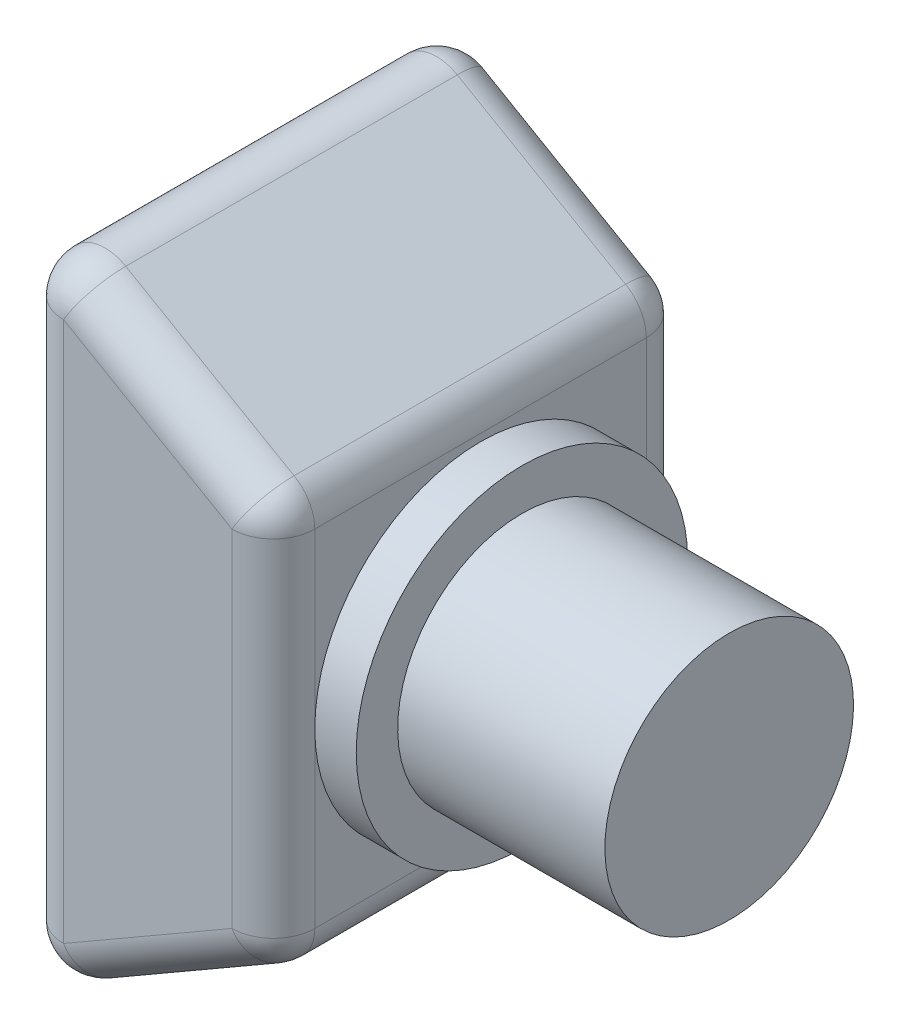
ISO-10303-21;
HEADER;
FILE_DESCRIPTION(('STEP AP214'),'2;1');
FILE_NAME('part.step','',(''),(''),'','','');
FILE_SCHEMA(('AUTOMOTIVE_DESIGN { 1 0 10303 214 1 1 1 1 }'));
ENDSEC;
DATA;
#1=APPLICATION_CONTEXT('core data for automotive mechanical design processes');
#2=APPLICATION_PROTOCOL_DEFINITION('international standard','automotive_design',2000,#1);
#3=PRODUCT_CONTEXT('',#1,'mechanical');
#4=PRODUCT('Part','Part','',(#3));
#5=PRODUCT_RELATED_PRODUCT_CATEGORY('part','',(#4));
#6=PRODUCT_DEFINITION_FORMATION('','',#4);
#7=PRODUCT_DEFINITION_CONTEXT('part definition',#1,'design');
#8=PRODUCT_DEFINITION('design','',#6,#7);
#9=PRODUCT_DEFINITION_SHAPE('','',#8);
#10=(LENGTH_UNIT() NAMED_UNIT(*) SI_UNIT(.MILLI.,.METRE.));
#11=(NAMED_UNIT(*) PLANE_ANGLE_UNIT() SI_UNIT($,.RADIAN.));
#12=(NAMED_UNIT(*) SI_UNIT($,.STERADIAN.) SOLID_ANGLE_UNIT());
#13=UNCERTAINTY_MEASURE_WITH_UNIT(LENGTH_MEASURE(1.E-05),#10,'distance_accuracy_value','');
#14=(GEOMETRIC_REPRESENTATION_CONTEXT(3) GLOBAL_UNCERTAINTY_ASSIGNED_CONTEXT((#13)) GLOBAL_UNIT_ASSIGNED_CONTEXT((#10,
#11,#12)) REPRESENTATION_CONTEXT('',''));
#15=CARTESIAN_POINT('',(0.,0.,0.));
#16=DIRECTION('',(0.,0.,1.));
#17=DIRECTION('',(1.,0.,0.));
#18=AXIS2_PLACEMENT_3D('',#15,#16,#17);
#19=CARTESIAN_POINT('',(6.06217782649105,4.75,10.));
#20=DIRECTION('',(-1.,0.,0.));
#21=DIRECTION('',(0.,0.,1.));
#22=AXIS2_PLACEMENT_3D('',#19,#20,#21);
#23=PLANE('',#22);
#24=CARTESIAN_POINT('',(6.06217782649105,0.,5.));
#25=DIRECTION('',(1.,0.,0.));
#26=DIRECTION('',(0.,1.,0.));
#27=AXIS2_PLACEMENT_3D('',#24,#25,#26);
#28=CIRCLE('',#27,4.);
#29=CARTESIAN_POINT('',(6.06217782649105,0.,9.));
#30=VERTEX_POINT('',#29);
#31=CARTESIAN_POINT('',(6.06217782649105,0.,0.999999999999999));
#32=VERTEX_POINT('',#31);
#33=EDGE_CURVE('E152',#30,#32,#28,.T.);
#34=ORIENTED_EDGE('',*,*,#33,.F.);
#35=DIRECTION('',(0.,1.,0.));
#36=VECTOR('',#35,1.);
#37=CARTESIAN_POINT('',(6.06217782649105,4.75,9.));
#38=LINE('',#37,#36);
#39=CARTESIAN_POINT('',(6.06217782649105,-4.17264973081038,9.));
#40=VERTEX_POINT('',#39);
#41=EDGE_CURVE('E139',#30,#40,#38,.F.);
#42=ORIENTED_EDGE('',*,*,#41,.T.);
#43=DIRECTION('',(0.,0.,-1.));
#44=VECTOR('',#43,1.);
#45=CARTESIAN_POINT('',(6.06217782649105,-4.17264973081038,10.));
#46=LINE('',#45,#44);
#47=CARTESIAN_POINT('',(6.06217782649105,-4.17264973081038,0.999999999999999));
#48=VERTEX_POINT('',#47);
#49=EDGE_CURVE('E177',#40,#48,#46,.T.);
#50=ORIENTED_EDGE('',*,*,#49,.T.);
#51=DIRECTION('',(0.,1.,0.));
#52=VECTOR('',#51,1.);
#53=CARTESIAN_POINT('',(6.06217782649105,4.17264973081038,0.999999999999999));
#54=LINE('',#53,#52);
#55=EDGE_CURVE('E149',#48,#32,#54,.T.);
#56=ORIENTED_EDGE('',*,*,#55,.T.);
#57=EDGE_LOOP('',(#34,#42,#50,#56));
#58=FACE_BOUND('',#57,.T.);
#59=ADVANCED_FACE('F34',(#58),#23,.F.);
#60=CARTESIAN_POINT('',(6.06217782649105,-4.75,10.));
#61=DIRECTION('',(-0.500000000000005,0.866025403784436,0.));
#62=DIRECTION('',(-0.866025403784436,-0.500000000000005,0.));
#63=AXIS2_PLACEMENT_3D('',#60,#61,#62);
#64=PLANE('',#63);
#65=DIRECTION('',(0.,0.,-1.));
#66=VECTOR('',#65,1.);
#67=CARTESIAN_POINT('',(5.56217782649106,-5.03867513459481,10.));
#68=LINE('',#67,#66);
#69=CARTESIAN_POINT('',(5.56217782649106,-5.03867513459481,0.999999999999999));
#70=VERTEX_POINT('',#69);
#71=CARTESIAN_POINT('',(5.56217782649106,-5.03867513459481,9.));
#72=VERTEX_POINT('',#71);
#73=EDGE_CURVE('E163',#70,#72,#68,.F.);
#74=ORIENTED_EDGE('',*,*,#73,.T.);
#75=DIRECTION('',(0.866025403784436,0.500000000000005,0.));
#76=VECTOR('',#75,1.);
#77=CARTESIAN_POINT('',(6.06217782649105,-4.75,9.));
#78=LINE('',#77,#76);
#79=CARTESIAN_POINT('',(1.5,-7.38397459621558,9.));
#80=VERTEX_POINT('',#79);
#81=EDGE_CURVE('E202',#72,#80,#78,.F.);
#82=ORIENTED_EDGE('',*,*,#81,.T.);
#83=DIRECTION('',(0.,0.,-1.));
#84=VECTOR('',#83,1.);
#85=CARTESIAN_POINT('',(1.5,-7.38397459621558,10.));
#86=LINE('',#85,#84);
#87=CARTESIAN_POINT('',(1.5,-7.38397459621558,0.999999999999999));
#88=VERTEX_POINT('',#87);
#89=EDGE_CURVE('E166',#80,#88,#86,.T.);
#90=ORIENTED_EDGE('',*,*,#89,.T.);
#91=DIRECTION('',(0.866025403784436,0.500000000000005,0.));
#92=VECTOR('',#91,1.);
#93=CARTESIAN_POINT('',(5.56217782649106,-5.03867513459481,0.999999999999999));
#94=LINE('',#93,#92);
#95=EDGE_CURVE('E200',#88,#70,#94,.T.);
#96=ORIENTED_EDGE('',*,*,#95,.T.);
#97=EDGE_LOOP('',(#74,#82,#90,#96));
#98=FACE_BOUND('',#97,.T.);
#99=ADVANCED_FACE('F333',(#98),#64,.F.);
#100=EDGE_CURVE('E51',#32,#30,#28,.T.);
#101=ORIENTED_EDGE('',*,*,#100,.F.);
#102=CARTESIAN_POINT('',(6.06217782649105,4.17264973081038,0.999999999999999));
#103=VERTEX_POINT('',#102);
#104=EDGE_CURVE('E233',#32,#103,#54,.T.);
#105=ORIENTED_EDGE('',*,*,#104,.T.);
#106=DIRECTION('',(0.,0.,-1.));
#107=VECTOR('',#106,1.);
#108=CARTESIAN_POINT('',(6.06217782649105,4.17264973081038,10.));
#109=LINE('',#108,#107);
#110=CARTESIAN_POINT('',(6.06217782649105,4.17264973081038,9.));
#111=VERTEX_POINT('',#110);
#112=EDGE_CURVE('E135',#103,#111,#109,.F.);
#113=ORIENTED_EDGE('',*,*,#112,.T.);
#114=EDGE_CURVE('E43',#111,#30,#38,.F.);
#115=ORIENTED_EDGE('',*,*,#114,.T.);
#116=EDGE_LOOP('',(#101,#105,#113,#115));
#117=FACE_BOUND('',#116,.T.);
#118=ADVANCED_FACE('F133',(#117),#23,.F.);
#119=CARTESIAN_POINT('',(0.,8.25000000000003,10.));
#120=DIRECTION('',(-0.500000000000004,-0.866025403784436,0.));
#121=DIRECTION('',(0.866025403784436,-0.500000000000004,0.));
#122=AXIS2_PLACEMENT_3D('',#119,#120,#121);
#123=PLANE('',#122);
#124=DIRECTION('',(0.,0.,-1.));
#125=VECTOR('',#124,1.);
#126=CARTESIAN_POINT('',(1.5,7.38397459621558,10.));
#127=LINE('',#126,#125);
#128=CARTESIAN_POINT('',(1.5,7.38397459621558,0.999999999999999));
#129=VERTEX_POINT('',#128);
#130=CARTESIAN_POINT('',(1.5,7.38397459621558,9.));
#131=VERTEX_POINT('',#130);
#132=EDGE_CURVE('E179',#129,#131,#127,.F.);
#133=ORIENTED_EDGE('',*,*,#132,.T.);
#134=DIRECTION('',(-0.866025403784436,0.500000000000004,0.));
#135=VECTOR('',#134,1.);
#136=CARTESIAN_POINT('',(0.,8.25000000000003,9.));
#137=LINE('',#136,#135);
#138=CARTESIAN_POINT('',(5.56217782649106,5.03867513459482,9.));
#139=VERTEX_POINT('',#138);
#140=EDGE_CURVE('E218',#131,#139,#137,.F.);
#141=ORIENTED_EDGE('',*,*,#140,.T.);
#142=DIRECTION('',(0.,0.,-1.));
#143=VECTOR('',#142,1.);
#144=CARTESIAN_POINT('',(5.56217782649106,5.03867513459482,10.));
#145=LINE('',#144,#143);
#146=CARTESIAN_POINT('',(5.56217782649106,5.03867513459482,0.999999999999999));
#147=VERTEX_POINT('',#146);
#148=EDGE_CURVE('E182',#139,#147,#145,.T.);
#149=ORIENTED_EDGE('',*,*,#148,.T.);
#150=DIRECTION('',(-0.866025403784436,0.500000000000004,0.));
#151=VECTOR('',#150,1.);
#152=CARTESIAN_POINT('',(1.5,7.38397459621558,0.999999999999999));
#153=LINE('',#152,#151);
#154=EDGE_CURVE('E216',#147,#129,#153,.T.);
#155=ORIENTED_EDGE('',*,*,#154,.T.);
#156=EDGE_LOOP('',(#133,#141,#149,#155));
#157=FACE_BOUND('',#156,.T.);
#158=ADVANCED_FACE('F316',(#157),#123,.F.);
#159=CARTESIAN_POINT('',(0.,-8.25000000000003,10.));
#160=DIRECTION('',(1.,0.,0.));
#161=DIRECTION('',(0.,1.,0.));
#162=AXIS2_PLACEMENT_3D('',#159,#160,#161);
#163=PLANE('',#162);
#164=DIRECTION('',(0.,0.,-1.));
#165=VECTOR('',#164,1.);
#166=CARTESIAN_POINT('',(0.,-6.51794919243114,10.));
#167=LINE('',#166,#165);
#168=CARTESIAN_POINT('',(0.,-6.51794919243114,0.999999999999999));
#169=VERTEX_POINT('',#168);
#170=CARTESIAN_POINT('',(0.,-6.51794919243114,9.));
#171=VERTEX_POINT('',#170);
#172=EDGE_CURVE('E173',#169,#171,#167,.F.);
#173=ORIENTED_EDGE('',*,*,#172,.T.);
#174=DIRECTION('',(0.,-1.,0.));
#175=VECTOR('',#174,1.);
#176=CARTESIAN_POINT('',(0.,-8.25000000000003,9.));
#177=LINE('',#176,#175);
#178=CARTESIAN_POINT('',(0.,6.51794919243114,9.));
#179=VERTEX_POINT('',#178);
#180=EDGE_CURVE('E210',#171,#179,#177,.F.);
#181=ORIENTED_EDGE('',*,*,#180,.T.);
#182=DIRECTION('',(0.,0.,-1.));
#183=VECTOR('',#182,1.);
#184=CARTESIAN_POINT('',(0.,6.51794919243114,10.));
#185=LINE('',#184,#183);
#186=CARTESIAN_POINT('',(0.,6.51794919243114,0.999999999999999));
#187=VERTEX_POINT('',#186);
#188=EDGE_CURVE('E170',#179,#187,#185,.T.);
#189=ORIENTED_EDGE('',*,*,#188,.T.);
#190=DIRECTION('',(0.,-1.,0.));
#191=VECTOR('',#190,1.);
#192=CARTESIAN_POINT('',(0.,-6.51794919243114,0.999999999999999));
#193=LINE('',#192,#191);
#194=EDGE_CURVE('E208',#187,#169,#193,.T.);
#195=ORIENTED_EDGE('',*,*,#194,.T.);
#196=EDGE_LOOP('',(#173,#181,#189,#195));
#197=FACE_BOUND('',#196,.T.);
#198=ADVANCED_FACE('F288',(#197),#163,.F.);
#199=CARTESIAN_POINT('',(0.,0.,10.));
#200=DIRECTION('',(0.,0.,-1.));
#201=DIRECTION('',(-1.,0.,0.));
#202=AXIS2_PLACEMENT_3D('',#199,#200,#201);
#203=PLANE('',#202);
#204=DIRECTION('',(0.,-1.,0.));
#205=VECTOR('',#204,1.);
#206=CARTESIAN_POINT('',(0.999999999999999,0.,10.));
#207=LINE('',#206,#205);
#208=CARTESIAN_POINT('',(0.999999999999998,6.51794919243114,10.));
#209=VERTEX_POINT('',#208);
#210=CARTESIAN_POINT('',(0.999999999999999,-6.51794919243114,10.));
#211=VERTEX_POINT('',#210);
#212=EDGE_CURVE('E195',#209,#211,#207,.T.);
#213=ORIENTED_EDGE('',*,*,#212,.T.);
#214=DIRECTION('',(0.866025403784436,0.500000000000005,0.));
#215=VECTOR('',#214,1.);
#216=CARTESIAN_POINT('',(3.07235479061084,-5.32147459621555,10.));
#217=LINE('',#216,#215);
#218=CARTESIAN_POINT('',(5.06217782649105,-4.17264973081038,10.));
#219=VERTEX_POINT('',#218);
#220=EDGE_CURVE('E197',#211,#219,#217,.T.);
#221=ORIENTED_EDGE('',*,*,#220,.T.);
#222=DIRECTION('',(0.,1.,0.));
#223=VECTOR('',#222,1.);
#224=CARTESIAN_POINT('',(5.06217782649105,0.,10.));
#225=LINE('',#224,#223);
#226=CARTESIAN_POINT('',(5.06217782649105,4.17264973081038,10.));
#227=VERTEX_POINT('',#226);
#228=EDGE_CURVE('E191',#219,#227,#225,.T.);
#229=ORIENTED_EDGE('',*,*,#228,.T.);
#230=DIRECTION('',(-0.866025403784436,0.500000000000004,0.));
#231=VECTOR('',#230,1.);
#232=CARTESIAN_POINT('',(3.07235479061084,5.32147459621555,10.));
#233=LINE('',#232,#231);
#234=EDGE_CURVE('E193',#227,#209,#233,.T.);
#235=ORIENTED_EDGE('',*,*,#234,.T.);
#236=EDGE_LOOP('',(#213,#221,#229,#235));
#237=FACE_BOUND('',#236,.T.);
#238=ADVANCED_FACE('F306',(#237),#203,.F.);
#239=CARTESIAN_POINT('',(0.,0.,0.));
#240=DIRECTION('',(0.,0.,-1.));
#241=DIRECTION('',(-1.,0.,0.));
#242=AXIS2_PLACEMENT_3D('',#239,#240,#241);
#243=PLANE('',#242);
#244=DIRECTION('',(0.,1.,0.));
#245=VECTOR('',#244,1.);
#246=CARTESIAN_POINT('',(5.06217782649105,-4.17264973081038,0.));
#247=LINE('',#246,#245);
#248=CARTESIAN_POINT('',(5.06217782649105,4.17264973081038,0.));
#249=VERTEX_POINT('',#248);
#250=CARTESIAN_POINT('',(5.06217782649105,-4.17264973081038,0.));
#251=VERTEX_POINT('',#250);
#252=EDGE_CURVE('E224',#249,#251,#247,.F.);
#253=ORIENTED_EDGE('',*,*,#252,.T.);
#254=DIRECTION('',(0.866025403784436,0.500000000000005,0.));
#255=VECTOR('',#254,1.);
#256=CARTESIAN_POINT('',(1.,-6.51794919243114,0.));
#257=LINE('',#256,#255);
#258=CARTESIAN_POINT('',(0.999999999999999,-6.51794919243114,0.));
#259=VERTEX_POINT('',#258);
#260=EDGE_CURVE('E230',#251,#259,#257,.F.);
#261=ORIENTED_EDGE('',*,*,#260,.T.);
#262=DIRECTION('',(0.,-1.,0.));
#263=VECTOR('',#262,1.);
#264=CARTESIAN_POINT('',(0.999999999999997,6.51794919243114,0.));
#265=LINE('',#264,#263);
#266=CARTESIAN_POINT('',(0.999999999999998,6.51794919243114,0.));
#267=VERTEX_POINT('',#266);
#268=EDGE_CURVE('E228',#259,#267,#265,.F.);
#269=ORIENTED_EDGE('',*,*,#268,.T.);
#270=DIRECTION('',(-0.866025403784436,0.500000000000004,0.));
#271=VECTOR('',#270,1.);
#272=CARTESIAN_POINT('',(5.06217782649105,4.17264973081038,0.));
#273=LINE('',#272,#271);
#274=EDGE_CURVE('E226',#267,#249,#273,.F.);
#275=ORIENTED_EDGE('',*,*,#274,.T.);
#276=EDGE_LOOP('',(#253,#261,#269,#275));
#277=FACE_BOUND('',#276,.T.);
#278=ADVANCED_FACE('F350',(#277),#243,.T.);
#279=CARTESIAN_POINT('',(0.999999999999999,-6.51794919243114,10.));
#280=DIRECTION('',(0.,0.,-1.));
#281=DIRECTION('',(-1.,0.,0.));
#282=AXIS2_PLACEMENT_3D('',#279,#280,#281);
#283=CYLINDRICAL_SURFACE('',#282,1.);
#284=ORIENTED_EDGE('',*,*,#89,.F.);
#285=CARTESIAN_POINT('',(0.999999999999999,-6.51794919243114,9.));
#286=DIRECTION('',(0.,0.,-1.));
#287=DIRECTION('',(-1.,0.,0.));
#288=AXIS2_PLACEMENT_3D('',#285,#286,#287);
#289=CIRCLE('',#288,1.);
#290=EDGE_CURVE('E206',#80,#171,#289,.T.);
#291=ORIENTED_EDGE('',*,*,#290,.T.);
#292=ORIENTED_EDGE('',*,*,#172,.F.);
#293=CARTESIAN_POINT('',(0.999999999999999,-6.51794919243114,0.999999999999999));
#294=DIRECTION('',(0.,0.,-1.));
#295=DIRECTION('',(-1.,0.,0.));
#296=AXIS2_PLACEMENT_3D('',#293,#294,#295);
#297=CIRCLE('',#296,1.);
#298=EDGE_CURVE('E204',#169,#88,#297,.F.);
#299=ORIENTED_EDGE('',*,*,#298,.T.);
#300=EDGE_LOOP('',(#284,#291,#292,#299));
#301=FACE_BOUND('',#300,.T.);
#302=ADVANCED_FACE('F353',(#301),#283,.T.);
#303=CARTESIAN_POINT('',(5.06217782649105,-4.17264973081038,10.));
#304=DIRECTION('',(0.,0.,-1.));
#305=DIRECTION('',(-1.,0.,0.));
#306=AXIS2_PLACEMENT_3D('',#303,#304,#305);
#307=CYLINDRICAL_SURFACE('',#306,1.);
#308=ORIENTED_EDGE('',*,*,#49,.F.);
#309=CARTESIAN_POINT('',(5.06217782649105,-4.17264973081038,9.));
#310=DIRECTION('',(0.,0.,-1.));
#311=DIRECTION('',(-1.,0.,0.));
#312=AXIS2_PLACEMENT_3D('',#309,#310,#311);
#313=CIRCLE('',#312,1.);
#314=EDGE_CURVE('E188',#40,#72,#313,.T.);
#315=ORIENTED_EDGE('',*,*,#314,.T.);
#316=ORIENTED_EDGE('',*,*,#73,.F.);
#317=CARTESIAN_POINT('',(5.06217782649105,-4.17264973081038,0.999999999999999));
#318=DIRECTION('',(0.,0.,-1.));
#319=DIRECTION('',(-1.,0.,0.));
#320=AXIS2_PLACEMENT_3D('',#317,#318,#319);
#321=CIRCLE('',#320,1.);
#322=EDGE_CURVE('E185',#70,#48,#321,.F.);
#323=ORIENTED_EDGE('',*,*,#322,.T.);
#324=EDGE_LOOP('',(#308,#315,#316,#323));
#325=FACE_BOUND('',#324,.T.);
#326=ADVANCED_FACE('F519',(#325),#307,.T.);
#327=CARTESIAN_POINT('',(5.06217782649105,4.17264973081038,10.));
#328=DIRECTION('',(0.,0.,-1.));
#329=DIRECTION('',(-1.,0.,0.));
#330=AXIS2_PLACEMENT_3D('',#327,#328,#329);
#331=CYLINDRICAL_SURFACE('',#330,1.);
#332=ORIENTED_EDGE('',*,*,#148,.F.);
#333=CARTESIAN_POINT('',(5.06217782649105,4.17264973081038,9.));
#334=DIRECTION('',(0.,0.,-1.));
#335=DIRECTION('',(-1.,0.,0.));
#336=AXIS2_PLACEMENT_3D('',#333,#334,#335);
#337=CIRCLE('',#336,1.);
#338=EDGE_CURVE('E222',#139,#111,#337,.T.);
#339=ORIENTED_EDGE('',*,*,#338,.T.);
#340=ORIENTED_EDGE('',*,*,#112,.F.);
#341=CARTESIAN_POINT('',(5.06217782649105,4.17264973081038,0.999999999999999));
#342=DIRECTION('',(0.,0.,-1.));
#343=DIRECTION('',(-1.,0.,0.));
#344=AXIS2_PLACEMENT_3D('',#341,#342,#343);
#345=CIRCLE('',#344,1.);
#346=EDGE_CURVE('E220',#103,#147,#345,.F.);
#347=ORIENTED_EDGE('',*,*,#346,.T.);
#348=EDGE_LOOP('',(#332,#339,#340,#347));
#349=FACE_BOUND('',#348,.T.);
#350=ADVANCED_FACE('F319',(#349),#331,.T.);
#351=CARTESIAN_POINT('',(0.999999999999997,6.51794919243114,10.));
#352=DIRECTION('',(0.,0.,-1.));
#353=DIRECTION('',(-1.,0.,0.));
#354=AXIS2_PLACEMENT_3D('',#351,#352,#353);
#355=CYLINDRICAL_SURFACE('',#354,1.);
#356=ORIENTED_EDGE('',*,*,#188,.F.);
#357=CARTESIAN_POINT('',(0.999999999999997,6.51794919243114,9.));
#358=DIRECTION('',(0.,0.,-1.));
#359=DIRECTION('',(-1.,0.,0.));
#360=AXIS2_PLACEMENT_3D('',#357,#358,#359);
#361=CIRCLE('',#360,1.);
#362=EDGE_CURVE('E214',#179,#131,#361,.T.);
#363=ORIENTED_EDGE('',*,*,#362,.T.);
#364=ORIENTED_EDGE('',*,*,#132,.F.);
#365=CARTESIAN_POINT('',(0.999999999999997,6.51794919243114,0.999999999999999));
#366=DIRECTION('',(0.,0.,-1.));
#367=DIRECTION('',(-1.,0.,0.));
#368=AXIS2_PLACEMENT_3D('',#365,#366,#367);
#369=CIRCLE('',#368,1.);
#370=EDGE_CURVE('E212',#129,#187,#369,.F.);
#371=ORIENTED_EDGE('',*,*,#370,.T.);
#372=EDGE_LOOP('',(#356,#363,#364,#371));
#373=FACE_BOUND('',#372,.T.);
#374=ADVANCED_FACE('F285',(#373),#355,.T.);
#375=CARTESIAN_POINT('',(0.999999999999997,6.51794919243114,9.));
#376=DIRECTION('',(0.,0.,-1.));
#377=DIRECTION('',(-1.,0.,0.));
#378=AXIS2_PLACEMENT_3D('',#375,#376,#377);
#379=SPHERICAL_SURFACE('',#378,1.);
#380=CARTESIAN_POINT('',(0.999999999999997,6.51794919243114,9.));
#381=DIRECTION('',(0.866025403784436,-0.500000000000004,0.));
#382=DIRECTION('',(0.500000000000005,0.866025403784436,0.));
#383=AXIS2_PLACEMENT_3D('',#380,#381,#382);
#384=CIRCLE('',#383,1.);
#385=EDGE_CURVE('E249',#131,#209,#384,.T.);
#386=ORIENTED_EDGE('',*,*,#385,.F.);
#387=ORIENTED_EDGE('',*,*,#362,.F.);
#388=CARTESIAN_POINT('',(0.999999999999997,6.51794919243114,9.));
#389=DIRECTION('',(0.,-1.,0.));
#390=DIRECTION('',(0.,0.,-1.));
#391=AXIS2_PLACEMENT_3D('',#388,#389,#390);
#392=CIRCLE('',#391,1.);
#393=EDGE_CURVE('E167',#209,#179,#392,.T.);
#394=ORIENTED_EDGE('',*,*,#393,.F.);
#395=EDGE_LOOP('',(#386,#387,#394));
#396=FACE_BOUND('',#395,.T.);
#397=ADVANCED_FACE('F314',(#396),#379,.T.);
#398=CARTESIAN_POINT('',(0.999999999999999,0.,9.));
#399=DIRECTION('',(0.,-1.,0.));
#400=DIRECTION('',(1.,0.,0.));
#401=AXIS2_PLACEMENT_3D('',#398,#399,#400);
#402=CYLINDRICAL_SURFACE('',#401,1.);
#403=ORIENTED_EDGE('',*,*,#393,.T.);
#404=ORIENTED_EDGE('',*,*,#180,.F.);
#405=CARTESIAN_POINT('',(0.999999999999999,-6.51794919243114,9.));
#406=DIRECTION('',(0.,-1.,0.));
#407=DIRECTION('',(0.,0.,-1.));
#408=AXIS2_PLACEMENT_3D('',#405,#406,#407);
#409=CIRCLE('',#408,1.);
#410=EDGE_CURVE('E246',#211,#171,#409,.T.);
#411=ORIENTED_EDGE('',*,*,#410,.F.);
#412=ORIENTED_EDGE('',*,*,#212,.F.);
#413=EDGE_LOOP('',(#403,#404,#411,#412));
#414=FACE_BOUND('',#413,.T.);
#415=ADVANCED_FACE('F293',(#414),#402,.T.);
#416=CARTESIAN_POINT('',(3.07235479061084,5.32147459621555,9.));
#417=DIRECTION('',(-0.866025403784436,0.500000000000004,0.));
#418=DIRECTION('',(-0.500000000000004,-0.866025403784436,0.));
#419=AXIS2_PLACEMENT_3D('',#416,#417,#418);
#420=CYLINDRICAL_SURFACE('',#419,1.);
#421=ORIENTED_EDGE('',*,*,#385,.T.);
#422=ORIENTED_EDGE('',*,*,#234,.F.);
#423=CARTESIAN_POINT('',(5.06217782649105,4.17264973081038,9.));
#424=DIRECTION('',(0.866025403784436,-0.500000000000004,0.));
#425=DIRECTION('',(0.500000000000004,0.866025403784437,0.));
#426=AXIS2_PLACEMENT_3D('',#423,#424,#425);
#427=CIRCLE('',#426,1.);
#428=EDGE_CURVE('E243',#139,#227,#427,.T.);
#429=ORIENTED_EDGE('',*,*,#428,.F.);
#430=ORIENTED_EDGE('',*,*,#140,.F.);
#431=EDGE_LOOP('',(#421,#422,#429,#430));
#432=FACE_BOUND('',#431,.T.);
#433=ADVANCED_FACE('F312',(#432),#420,.T.);
#434=CARTESIAN_POINT('',(0.999999999999999,-6.51794919243114,9.));
#435=DIRECTION('',(0.,0.,-1.));
#436=DIRECTION('',(-1.,0.,0.));
#437=AXIS2_PLACEMENT_3D('',#434,#435,#436);
#438=SPHERICAL_SURFACE('',#437,1.);
#439=ORIENTED_EDGE('',*,*,#410,.T.);
#440=ORIENTED_EDGE('',*,*,#290,.F.);
#441=CARTESIAN_POINT('',(0.999999999999999,-6.51794919243114,9.));
#442=DIRECTION('',(0.866025403784436,0.500000000000005,0.));
#443=DIRECTION('',(-0.500000000000005,0.866025403784436,0.));
#444=AXIS2_PLACEMENT_3D('',#441,#442,#443);
#445=CIRCLE('',#444,1.);
#446=EDGE_CURVE('E240',#211,#80,#445,.T.);
#447=ORIENTED_EDGE('',*,*,#446,.F.);
#448=EDGE_LOOP('',(#439,#440,#447));
#449=FACE_BOUND('',#448,.T.);
#450=ADVANCED_FACE('F299',(#449),#438,.T.);
#451=CARTESIAN_POINT('',(5.06217782649105,4.17264973081038,9.));
#452=DIRECTION('',(0.,0.,-1.));
#453=DIRECTION('',(-1.,0.,0.));
#454=AXIS2_PLACEMENT_3D('',#451,#452,#453);
#455=SPHERICAL_SURFACE('',#454,1.);
#456=ORIENTED_EDGE('',*,*,#338,.F.);
#457=ORIENTED_EDGE('',*,*,#428,.T.);
#458=CARTESIAN_POINT('',(5.06217782649105,4.17264973081038,9.));
#459=DIRECTION('',(0.,-1.,0.));
#460=DIRECTION('',(0.,0.,-1.));
#461=AXIS2_PLACEMENT_3D('',#458,#459,#460);
#462=CIRCLE('',#461,1.);
#463=EDGE_CURVE('E238',#111,#227,#462,.T.);
#464=ORIENTED_EDGE('',*,*,#463,.F.);
#465=EDGE_LOOP('',(#456,#457,#464));
#466=FACE_BOUND('',#465,.T.);
#467=ADVANCED_FACE('F323',(#466),#455,.T.);
#468=CARTESIAN_POINT('',(3.07235479061084,-5.32147459621555,9.));
#469=DIRECTION('',(0.866025403784436,0.500000000000005,0.));
#470=DIRECTION('',(-0.500000000000005,0.866025403784436,0.));
#471=AXIS2_PLACEMENT_3D('',#468,#469,#470);
#472=CYLINDRICAL_SURFACE('',#471,1.);
#473=ORIENTED_EDGE('',*,*,#446,.T.);
#474=ORIENTED_EDGE('',*,*,#81,.F.);
#475=CARTESIAN_POINT('',(5.06217782649105,-4.17264973081038,9.));
#476=DIRECTION('',(0.866025403784436,0.500000000000004,0.));
#477=DIRECTION('',(-0.500000000000004,0.866025403784436,0.));
#478=AXIS2_PLACEMENT_3D('',#475,#476,#477);
#479=CIRCLE('',#478,1.);
#480=EDGE_CURVE('E236',#219,#72,#479,.T.);
#481=ORIENTED_EDGE('',*,*,#480,.F.);
#482=ORIENTED_EDGE('',*,*,#220,.F.);
#483=EDGE_LOOP('',(#473,#474,#481,#482));
#484=FACE_BOUND('',#483,.T.);
#485=ADVANCED_FACE('F304',(#484),#472,.T.);
#486=CARTESIAN_POINT('',(5.06217782649105,0.,9.));
#487=DIRECTION('',(0.,1.,0.));
#488=DIRECTION('',(0.,0.,1.));
#489=AXIS2_PLACEMENT_3D('',#486,#487,#488);
#490=CYLINDRICAL_SURFACE('',#489,1.);
#491=ORIENTED_EDGE('',*,*,#463,.T.);
#492=ORIENTED_EDGE('',*,*,#228,.F.);
#493=CARTESIAN_POINT('',(5.06217782649105,-4.17264973081038,9.));
#494=DIRECTION('',(0.,-1.,0.));
#495=DIRECTION('',(0.,0.,-1.));
#496=AXIS2_PLACEMENT_3D('',#493,#494,#495);
#497=CIRCLE('',#496,1.);
#498=EDGE_CURVE('E145',#40,#219,#497,.T.);
#499=ORIENTED_EDGE('',*,*,#498,.F.);
#500=ORIENTED_EDGE('',*,*,#41,.F.);
#501=ORIENTED_EDGE('',*,*,#114,.F.);
#502=EDGE_LOOP('',(#491,#492,#499,#500,#501));
#503=FACE_BOUND('',#502,.T.);
#504=ADVANCED_FACE('F143',(#503),#490,.T.);
#505=CARTESIAN_POINT('',(5.06217782649105,-4.17264973081038,9.));
#506=DIRECTION('',(0.,0.,-1.));
#507=DIRECTION('',(-1.,0.,0.));
#508=AXIS2_PLACEMENT_3D('',#505,#506,#507);
#509=SPHERICAL_SURFACE('',#508,1.);
#510=ORIENTED_EDGE('',*,*,#480,.T.);
#511=ORIENTED_EDGE('',*,*,#314,.F.);
#512=ORIENTED_EDGE('',*,*,#498,.T.);
#513=EDGE_LOOP('',(#510,#511,#512));
#514=FACE_BOUND('',#513,.T.);
#515=ADVANCED_FACE('F449',(#514),#509,.T.);
#516=CARTESIAN_POINT('',(0.999999999999997,6.51794919243114,0.999999999999999));
#517=DIRECTION('',(0.,0.,-1.));
#518=DIRECTION('',(-1.,0.,0.));
#519=AXIS2_PLACEMENT_3D('',#516,#517,#518);
#520=SPHERICAL_SURFACE('',#519,1.);
#521=CARTESIAN_POINT('',(0.999999999999997,6.51794919243114,0.999999999999999));
#522=DIRECTION('',(0.,-1.,0.));
#523=DIRECTION('',(0.,0.,-1.));
#524=AXIS2_PLACEMENT_3D('',#521,#522,#523);
#525=CIRCLE('',#524,1.);
#526=EDGE_CURVE('E267',#187,#267,#525,.T.);
#527=ORIENTED_EDGE('',*,*,#526,.F.);
#528=ORIENTED_EDGE('',*,*,#370,.F.);
#529=CARTESIAN_POINT('',(0.999999999999997,6.51794919243114,1.));
#530=DIRECTION('',(0.866025403784436,-0.500000000000004,0.));
#531=DIRECTION('',(0.500000000000004,0.866025403784436,0.));
#532=AXIS2_PLACEMENT_3D('',#529,#530,#531);
#533=CIRCLE('',#532,1.);
#534=EDGE_CURVE('E38',#267,#129,#533,.T.);
#535=ORIENTED_EDGE('',*,*,#534,.F.);
#536=EDGE_LOOP('',(#527,#528,#535));
#537=FACE_BOUND('',#536,.T.);
#538=ADVANCED_FACE('F36',(#537),#520,.T.);
#539=CARTESIAN_POINT('',(-0.500000000000007,7.38397459621559,0.999999999999999));
#540=DIRECTION('',(0.866025403784436,-0.500000000000004,0.));
#541=DIRECTION('',(0.500000000000004,0.866025403784436,0.));
#542=AXIS2_PLACEMENT_3D('',#539,#540,#541);
#543=CYLINDRICAL_SURFACE('',#542,1.);
#544=ORIENTED_EDGE('',*,*,#534,.T.);
#545=ORIENTED_EDGE('',*,*,#154,.F.);
#546=CARTESIAN_POINT('',(5.06217782649105,4.17264973081038,1.));
#547=DIRECTION('',(0.866025403784436,-0.500000000000004,0.));
#548=DIRECTION('',(0.500000000000004,0.866025403784436,0.));
#549=AXIS2_PLACEMENT_3D('',#546,#547,#548);
#550=CIRCLE('',#549,1.);
#551=EDGE_CURVE('E265',#249,#147,#550,.T.);
#552=ORIENTED_EDGE('',*,*,#551,.F.);
#553=ORIENTED_EDGE('',*,*,#274,.F.);
#554=EDGE_LOOP('',(#544,#545,#552,#553));
#555=FACE_BOUND('',#554,.T.);
#556=ADVANCED_FACE('F278',(#555),#543,.T.);
#557=CARTESIAN_POINT('',(1.,-8.25000000000003,0.999999999999999));
#558=DIRECTION('',(0.,1.,0.));
#559=DIRECTION('',(-1.,0.,0.));
#560=AXIS2_PLACEMENT_3D('',#557,#558,#559);
#561=CYLINDRICAL_SURFACE('',#560,1.);
#562=ORIENTED_EDGE('',*,*,#526,.T.);
#563=ORIENTED_EDGE('',*,*,#268,.F.);
#564=CARTESIAN_POINT('',(0.999999999999999,-6.51794919243114,0.999999999999999));
#565=DIRECTION('',(0.,-1.,0.));
#566=DIRECTION('',(0.,0.,-1.));
#567=AXIS2_PLACEMENT_3D('',#564,#565,#566);
#568=CIRCLE('',#567,1.);
#569=EDGE_CURVE('E263',#169,#259,#568,.T.);
#570=ORIENTED_EDGE('',*,*,#569,.F.);
#571=ORIENTED_EDGE('',*,*,#194,.F.);
#572=EDGE_LOOP('',(#562,#563,#570,#571));
#573=FACE_BOUND('',#572,.T.);
#574=ADVANCED_FACE('F430',(#573),#561,.T.);
#575=CARTESIAN_POINT('',(5.06217782649105,4.17264973081038,0.999999999999999));
#576=DIRECTION('',(0.,0.,-1.));
#577=DIRECTION('',(-1.,0.,0.));
#578=AXIS2_PLACEMENT_3D('',#575,#576,#577);
#579=SPHERICAL_SURFACE('',#578,1.);
#580=ORIENTED_EDGE('',*,*,#551,.T.);
#581=ORIENTED_EDGE('',*,*,#346,.F.);
#582=CARTESIAN_POINT('',(5.06217782649105,4.17264973081038,1.));
#583=DIRECTION('',(0.,-1.,0.));
#584=DIRECTION('',(0.,0.,-1.));
#585=AXIS2_PLACEMENT_3D('',#582,#583,#584);
#586=CIRCLE('',#585,1.);
#587=EDGE_CURVE('E260',#249,#103,#586,.T.);
#588=ORIENTED_EDGE('',*,*,#587,.F.);
#589=EDGE_LOOP('',(#580,#581,#588));
#590=FACE_BOUND('',#589,.T.);
#591=ADVANCED_FACE('F422',(#590),#579,.T.);
#592=CARTESIAN_POINT('',(0.999999999999999,-6.51794919243114,0.999999999999999));
#593=DIRECTION('',(0.,0.,-1.));
#594=DIRECTION('',(-1.,0.,0.));
#595=AXIS2_PLACEMENT_3D('',#592,#593,#594);
#596=SPHERICAL_SURFACE('',#595,1.);
#597=ORIENTED_EDGE('',*,*,#298,.F.);
#598=ORIENTED_EDGE('',*,*,#569,.T.);
#599=CARTESIAN_POINT('',(0.999999999999999,-6.51794919243114,0.999999999999999));
#600=DIRECTION('',(0.866025403784436,0.500000000000005,0.));
#601=DIRECTION('',(-0.500000000000005,0.866025403784436,0.));
#602=AXIS2_PLACEMENT_3D('',#599,#600,#601);
#603=CIRCLE('',#602,1.);
#604=EDGE_CURVE('E59',#88,#259,#603,.T.);
#605=ORIENTED_EDGE('',*,*,#604,.F.);
#606=EDGE_LOOP('',(#597,#598,#605));
#607=FACE_BOUND('',#606,.T.);
#608=ADVANCED_FACE('F414',(#607),#596,.T.);
#609=CARTESIAN_POINT('',(5.06217782649105,4.75,0.999999999999999));
#610=DIRECTION('',(0.,-1.,0.));
#611=DIRECTION('',(0.,0.,-1.));
#612=AXIS2_PLACEMENT_3D('',#609,#610,#611);
#613=CYLINDRICAL_SURFACE('',#612,1.);
#614=ORIENTED_EDGE('',*,*,#587,.T.);
#615=ORIENTED_EDGE('',*,*,#104,.F.);
#616=ORIENTED_EDGE('',*,*,#55,.F.);
#617=CARTESIAN_POINT('',(5.06217782649105,-4.17264973081038,1.));
#618=DIRECTION('',(0.,-1.,0.));
#619=DIRECTION('',(0.,0.,-1.));
#620=AXIS2_PLACEMENT_3D('',#617,#618,#619);
#621=CIRCLE('',#620,1.);
#622=EDGE_CURVE('E257',#251,#48,#621,.T.);
#623=ORIENTED_EDGE('',*,*,#622,.F.);
#624=ORIENTED_EDGE('',*,*,#252,.F.);
#625=EDGE_LOOP('',(#614,#615,#616,#623,#624));
#626=FACE_BOUND('',#625,.T.);
#627=ADVANCED_FACE('F407',(#626),#613,.T.);
#628=CARTESIAN_POINT('',(5.56217782649105,-3.88397459621556,0.999999999999999));
#629=DIRECTION('',(-0.866025403784436,-0.500000000000005,0.));
#630=DIRECTION('',(0.500000000000005,-0.866025403784436,0.));
#631=AXIS2_PLACEMENT_3D('',#628,#629,#630);
#632=CYLINDRICAL_SURFACE('',#631,1.);
#633=ORIENTED_EDGE('',*,*,#604,.T.);
#634=ORIENTED_EDGE('',*,*,#260,.F.);
#635=CARTESIAN_POINT('',(5.06217782649105,-4.17264973081038,0.999999999999999));
#636=DIRECTION('',(0.866025403784436,0.500000000000005,0.));
#637=DIRECTION('',(-0.500000000000005,0.866025403784436,0.));
#638=AXIS2_PLACEMENT_3D('',#635,#636,#637);
#639=CIRCLE('',#638,1.);
#640=EDGE_CURVE('E254',#70,#251,#639,.T.);
#641=ORIENTED_EDGE('',*,*,#640,.F.);
#642=ORIENTED_EDGE('',*,*,#95,.F.);
#643=EDGE_LOOP('',(#633,#634,#641,#642));
#644=FACE_BOUND('',#643,.T.);
#645=ADVANCED_FACE('F399',(#644),#632,.T.);
#646=CARTESIAN_POINT('',(5.06217782649105,-4.17264973081038,0.999999999999999));
#647=DIRECTION('',(0.,0.,-1.));
#648=DIRECTION('',(-1.,0.,0.));
#649=AXIS2_PLACEMENT_3D('',#646,#647,#648);
#650=SPHERICAL_SURFACE('',#649,1.);
#651=ORIENTED_EDGE('',*,*,#622,.T.);
#652=ORIENTED_EDGE('',*,*,#322,.F.);
#653=ORIENTED_EDGE('',*,*,#640,.T.);
#654=EDGE_LOOP('',(#651,#652,#653));
#655=FACE_BOUND('',#654,.T.);
#656=ADVANCED_FACE('F360',(#655),#650,.T.);
#657=CARTESIAN_POINT('',(7.06217782649105,0.,5.));
#658=DIRECTION('',(-1.,0.,0.));
#659=DIRECTION('',(0.,-1.,0.));
#660=AXIS2_PLACEMENT_3D('',#657,#658,#659);
#661=CYLINDRICAL_SURFACE('',#660,4.);
#662=CARTESIAN_POINT('',(7.06217782649105,0.,5.));
#663=DIRECTION('',(1.,0.,0.));
#664=DIRECTION('',(0.,1.,0.));
#665=AXIS2_PLACEMENT_3D('',#662,#663,#664);
#666=CIRCLE('',#665,4.);
#667=CARTESIAN_POINT('',(7.06217782649105,4.,5.));
#668=VERTEX_POINT('',#667);
#669=EDGE_CURVE('E155',#668,#668,#666,.T.);
#670=ORIENTED_EDGE('',*,*,#669,.F.);
#671=EDGE_LOOP('',(#670));
#672=FACE_BOUND('',#671,.T.);
#673=ORIENTED_EDGE('',*,*,#33,.T.);
#674=ORIENTED_EDGE('',*,*,#100,.T.);
#675=EDGE_LOOP('',(#673,#674));
#676=FACE_BOUND('',#675,.T.);
#677=ADVANCED_FACE('F157',(#672,#676),#661,.T.);
#678=CARTESIAN_POINT('',(7.06217782649105,0.,5.));
#679=DIRECTION('',(1.,0.,0.));
#680=DIRECTION('',(0.,1.,0.));
#681=AXIS2_PLACEMENT_3D('',#678,#679,#680);
#682=PLANE('',#681);
#683=CARTESIAN_POINT('',(7.06217782649105,0.,5.));
#684=DIRECTION('',(1.,0.,0.));
#685=DIRECTION('',(0.,1.,0.));
#686=AXIS2_PLACEMENT_3D('',#683,#684,#685);
#687=CIRCLE('',#686,3.);
#688=CARTESIAN_POINT('',(7.06217782649105,3.,5.));
#689=VERTEX_POINT('',#688);
#690=EDGE_CURVE('E11',#689,#689,#687,.T.);
#691=ORIENTED_EDGE('',*,*,#690,.F.);
#692=EDGE_LOOP('',(#691));
#693=FACE_BOUND('',#692,.T.);
#694=ORIENTED_EDGE('',*,*,#669,.T.);
#695=EDGE_LOOP('',(#694));
#696=FACE_BOUND('',#695,.T.);
#697=ADVANCED_FACE('F359',(#693,#696),#682,.T.);
#698=CARTESIAN_POINT('',(12.0621778264911,0.,5.));
#699=DIRECTION('',(-1.,0.,0.));
#700=DIRECTION('',(0.,-1.,0.));
#701=AXIS2_PLACEMENT_3D('',#698,#699,#700);
#702=CYLINDRICAL_SURFACE('',#701,3.);
#703=CARTESIAN_POINT('',(12.0621778264911,0.,5.));
#704=DIRECTION('',(1.,0.,0.));
#705=DIRECTION('',(0.,1.,0.));
#706=AXIS2_PLACEMENT_3D('',#703,#704,#705);
#707=CIRCLE('',#706,3.);
#708=CARTESIAN_POINT('',(12.0621778264911,3.,5.));
#709=VERTEX_POINT('',#708);
#710=EDGE_CURVE('E158',#709,#709,#707,.T.);
#711=ORIENTED_EDGE('',*,*,#710,.F.);
#712=EDGE_LOOP('',(#711));
#713=FACE_BOUND('',#712,.T.);
#714=ORIENTED_EDGE('',*,*,#690,.T.);
#715=EDGE_LOOP('',(#714));
#716=FACE_BOUND('',#715,.T.);
#717=ADVANCED_FACE('F364',(#713,#716),#702,.T.);
#718=CARTESIAN_POINT('',(12.0621778264911,0.,5.));
#719=DIRECTION('',(1.,0.,0.));
#720=DIRECTION('',(0.,1.,0.));
#721=AXIS2_PLACEMENT_3D('',#718,#719,#720);
#722=PLANE('',#721);
#723=ORIENTED_EDGE('',*,*,#710,.T.);
#724=EDGE_LOOP('',(#723));
#725=FACE_BOUND('',#724,.T.);
#726=ADVANCED_FACE('F368',(#725),#722,.T.);
#727=CLOSED_SHELL('',(#59,#99,#118,#158,#198,#238,#278,#302,#326,#350,#374,#397,#415,#433,#450,
#467,#485,#504,#515,#538,#556,#574,#591,#608,#627,#645,#656,#677,#697,#717,#726));
#728=MANIFOLD_SOLID_BREP('B2',#727);
#729=ADVANCED_BREP_SHAPE_REPRESENTATION('',(#18,#728),#14);
#730=SHAPE_DEFINITION_REPRESENTATION(#9,#729);
ENDSEC;
END-ISO-10303-21;
